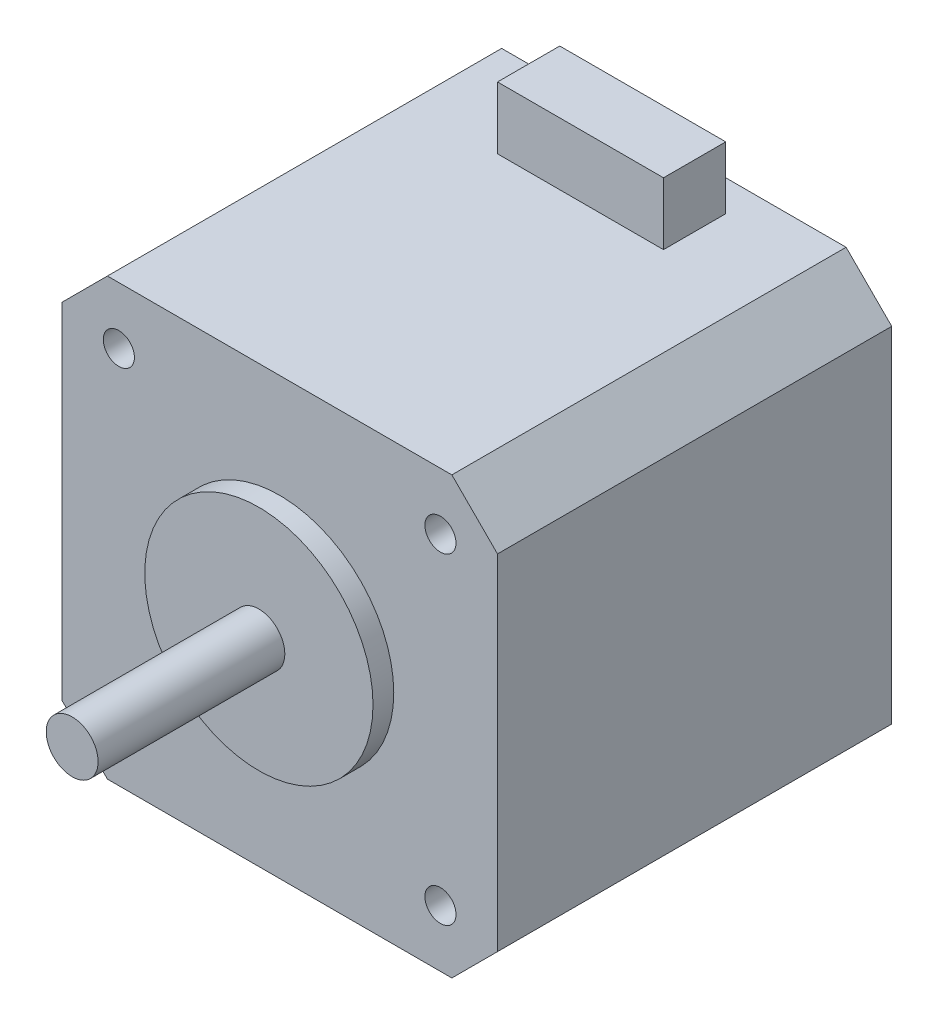
ISO-10303-21;
HEADER;
FILE_DESCRIPTION(('STEP AP214'),'2;1');
FILE_NAME('part.step','',(''),(''),'','','');
FILE_SCHEMA(('AUTOMOTIVE_DESIGN { 1 0 10303 214 1 1 1 1 }'));
ENDSEC;
DATA;
#1=APPLICATION_CONTEXT('core data for automotive mechanical design processes');
#2=APPLICATION_PROTOCOL_DEFINITION('international standard','automotive_design',2000,#1);
#3=PRODUCT_CONTEXT('',#1,'mechanical');
#4=PRODUCT('Part','Part','',(#3));
#5=PRODUCT_RELATED_PRODUCT_CATEGORY('part','',(#4));
#6=PRODUCT_DEFINITION_FORMATION('','',#4);
#7=PRODUCT_DEFINITION_CONTEXT('part definition',#1,'design');
#8=PRODUCT_DEFINITION('design','',#6,#7);
#9=PRODUCT_DEFINITION_SHAPE('','',#8);
#10=(LENGTH_UNIT() NAMED_UNIT(*) SI_UNIT(.MILLI.,.METRE.));
#11=(NAMED_UNIT(*) PLANE_ANGLE_UNIT() SI_UNIT($,.RADIAN.));
#12=(NAMED_UNIT(*) SI_UNIT($,.STERADIAN.) SOLID_ANGLE_UNIT());
#13=UNCERTAINTY_MEASURE_WITH_UNIT(LENGTH_MEASURE(1.E-05),#10,'distance_accuracy_value','');
#14=(GEOMETRIC_REPRESENTATION_CONTEXT(3) GLOBAL_UNCERTAINTY_ASSIGNED_CONTEXT((#13)) GLOBAL_UNIT_ASSIGNED_CONTEXT((#10,
#11,#12)) REPRESENTATION_CONTEXT('',''));
#15=CARTESIAN_POINT('',(0.,0.,0.));
#16=DIRECTION('',(0.,0.,1.));
#17=DIRECTION('',(1.,0.,0.));
#18=AXIS2_PLACEMENT_3D('',#15,#16,#17);
#19=CARTESIAN_POINT('',(0.,0.,38.));
#20=DIRECTION('',(0.,0.,1.));
#21=DIRECTION('',(1.,0.,0.));
#22=AXIS2_PLACEMENT_3D('',#19,#20,#21);
#23=PLANE('',#22);
#24=CARTESIAN_POINT('',(0.,0.,38.));
#25=DIRECTION('',(0.,0.,1.));
#26=DIRECTION('',(1.,0.,0.));
#27=AXIS2_PLACEMENT_3D('',#24,#25,#26);
#28=CIRCLE('',#27,11.);
#29=CARTESIAN_POINT('',(11.,0.,38.));
#30=VERTEX_POINT('',#29);
#31=EDGE_CURVE('E262',#30,#30,#28,.T.);
#32=ORIENTED_EDGE('',*,*,#31,.F.);
#33=EDGE_LOOP('',(#32));
#34=FACE_BOUND('',#33,.T.);
#35=CARTESIAN_POINT('',(-15.5000000000001,-15.4999999999999,38.));
#36=DIRECTION('',(0.,0.,1.));
#37=DIRECTION('',(1.,0.,0.));
#38=AXIS2_PLACEMENT_3D('',#35,#36,#37);
#39=CIRCLE('',#38,1.5);
#40=CARTESIAN_POINT('',(-14.0000000000001,-15.4999999999999,38.));
#41=VERTEX_POINT('',#40);
#42=EDGE_CURVE('E242',#41,#41,#39,.T.);
#43=ORIENTED_EDGE('',*,*,#42,.F.);
#44=EDGE_LOOP('',(#43));
#45=FACE_BOUND('',#44,.T.);
#46=CARTESIAN_POINT('',(15.5,15.5,38.));
#47=DIRECTION('',(0.,0.,1.));
#48=DIRECTION('',(1.,0.,0.));
#49=AXIS2_PLACEMENT_3D('',#46,#47,#48);
#50=CIRCLE('',#49,1.5);
#51=CARTESIAN_POINT('',(17.,15.5,38.));
#52=VERTEX_POINT('',#51);
#53=EDGE_CURVE('E161',#52,#52,#50,.T.);
#54=ORIENTED_EDGE('',*,*,#53,.F.);
#55=EDGE_LOOP('',(#54));
#56=FACE_BOUND('',#55,.T.);
#57=DIRECTION('',(0.,1.,0.));
#58=VECTOR('',#57,1.);
#59=CARTESIAN_POINT('',(20.9999999999999,-16.6000000000001,38.));
#60=LINE('',#59,#58);
#61=CARTESIAN_POINT('',(20.9999999999999,-16.6000000000001,38.));
#62=VERTEX_POINT('',#61);
#63=CARTESIAN_POINT('',(21.,16.6,38.));
#64=VERTEX_POINT('',#63);
#65=EDGE_CURVE('E108',#62,#64,#60,.T.);
#66=ORIENTED_EDGE('',*,*,#65,.T.);
#67=DIRECTION('',(-0.707106781186548,0.707106781186548,0.));
#68=VECTOR('',#67,1.);
#69=CARTESIAN_POINT('',(21.,16.6,38.));
#70=LINE('',#69,#68);
#71=CARTESIAN_POINT('',(16.6,21.,38.));
#72=VERTEX_POINT('',#71);
#73=EDGE_CURVE('E209',#64,#72,#70,.T.);
#74=ORIENTED_EDGE('',*,*,#73,.T.);
#75=DIRECTION('',(-1.,0.,0.));
#76=VECTOR('',#75,1.);
#77=CARTESIAN_POINT('',(16.6,21.,38.));
#78=LINE('',#77,#76);
#79=CARTESIAN_POINT('',(-16.5999999999998,21.0000000000002,38.));
#80=VERTEX_POINT('',#79);
#81=EDGE_CURVE('E205',#72,#80,#78,.T.);
#82=ORIENTED_EDGE('',*,*,#81,.T.);
#83=DIRECTION('',(-0.707106781186555,-0.70710678118654,0.));
#84=VECTOR('',#83,1.);
#85=CARTESIAN_POINT('',(-16.5999999999998,21.0000000000002,38.));
#86=LINE('',#85,#84);
#87=CARTESIAN_POINT('',(-20.9999999999998,16.6000000000002,38.));
#88=VERTEX_POINT('',#87);
#89=EDGE_CURVE('E220',#80,#88,#86,.T.);
#90=ORIENTED_EDGE('',*,*,#89,.T.);
#91=DIRECTION('',(0.,-1.,0.));
#92=VECTOR('',#91,1.);
#93=CARTESIAN_POINT('',(-20.9999999999998,16.6000000000002,38.));
#94=LINE('',#93,#92);
#95=CARTESIAN_POINT('',(-21.0000000000001,-16.5999999999999,38.));
#96=VERTEX_POINT('',#95);
#97=EDGE_CURVE('E132',#88,#96,#94,.T.);
#98=ORIENTED_EDGE('',*,*,#97,.T.);
#99=DIRECTION('',(0.707106781186542,-0.707106781186553,0.));
#100=VECTOR('',#99,1.);
#101=CARTESIAN_POINT('',(-21.0000000000001,-16.5999999999999,38.));
#102=LINE('',#101,#100);
#103=CARTESIAN_POINT('',(-16.6000000000002,-20.9999999999999,38.));
#104=VERTEX_POINT('',#103);
#105=EDGE_CURVE('E125',#96,#104,#102,.T.);
#106=ORIENTED_EDGE('',*,*,#105,.T.);
#107=DIRECTION('',(1.,0.,0.));
#108=VECTOR('',#107,1.);
#109=CARTESIAN_POINT('',(-16.6000000000002,-20.9999999999999,38.));
#110=LINE('',#109,#108);
#111=CARTESIAN_POINT('',(16.5999999999999,-21.0000000000001,38.));
#112=VERTEX_POINT('',#111);
#113=EDGE_CURVE('E129',#104,#112,#110,.T.);
#114=ORIENTED_EDGE('',*,*,#113,.T.);
#115=DIRECTION('',(0.70710678118655,0.707106781186545,0.));
#116=VECTOR('',#115,1.);
#117=CARTESIAN_POINT('',(16.5999999999999,-21.0000000000001,38.));
#118=LINE('',#117,#116);
#119=EDGE_CURVE('E69',#112,#62,#118,.T.);
#120=ORIENTED_EDGE('',*,*,#119,.T.);
#121=EDGE_LOOP('',(#66,#74,#82,#90,#98,#106,#114,#120));
#122=FACE_BOUND('',#121,.T.);
#123=CARTESIAN_POINT('',(15.4999999999999,-15.5000000000001,38.));
#124=DIRECTION('',(0.,0.,1.));
#125=DIRECTION('',(1.,0.,0.));
#126=AXIS2_PLACEMENT_3D('',#123,#124,#125);
#127=CIRCLE('',#126,1.5);
#128=CARTESIAN_POINT('',(16.9999999999999,-15.5000000000001,38.));
#129=VERTEX_POINT('',#128);
#130=EDGE_CURVE('E234',#129,#129,#127,.T.);
#131=ORIENTED_EDGE('',*,*,#130,.F.);
#132=EDGE_LOOP('',(#131));
#133=FACE_BOUND('',#132,.T.);
#134=CARTESIAN_POINT('',(-15.4999999999998,15.5000000000002,38.));
#135=DIRECTION('',(0.,0.,1.));
#136=DIRECTION('',(1.,0.,0.));
#137=AXIS2_PLACEMENT_3D('',#134,#135,#136);
#138=CIRCLE('',#137,1.5);
#139=CARTESIAN_POINT('',(-13.9999999999998,15.5000000000002,38.));
#140=VERTEX_POINT('',#139);
#141=EDGE_CURVE('E250',#140,#140,#138,.T.);
#142=ORIENTED_EDGE('',*,*,#141,.F.);
#143=EDGE_LOOP('',(#142));
#144=FACE_BOUND('',#143,.T.);
#145=ADVANCED_FACE('F43',(#34,#45,#56,#122,#133,#144),#23,.T.);
#146=CARTESIAN_POINT('',(0.,0.,0.));
#147=DIRECTION('',(0.,0.,1.));
#148=DIRECTION('',(1.,0.,0.));
#149=AXIS2_PLACEMENT_3D('',#146,#147,#148);
#150=PLANE('',#149);
#151=DIRECTION('',(0.,1.,0.));
#152=VECTOR('',#151,1.);
#153=CARTESIAN_POINT('',(21.,0.,0.));
#154=LINE('',#153,#152);
#155=CARTESIAN_POINT('',(20.9999999999999,-16.6000000000001,0.));
#156=VERTEX_POINT('',#155);
#157=CARTESIAN_POINT('',(21.,16.6,0.));
#158=VERTEX_POINT('',#157);
#159=EDGE_CURVE('E102',#156,#158,#154,.T.);
#160=ORIENTED_EDGE('',*,*,#159,.F.);
#161=DIRECTION('',(0.70710678118655,0.707106781186545,0.));
#162=VECTOR('',#161,1.);
#163=CARTESIAN_POINT('',(16.5999999999999,-21.0000000000001,0.));
#164=LINE('',#163,#162);
#165=CARTESIAN_POINT('',(16.5999999999999,-21.0000000000001,0.));
#166=VERTEX_POINT('',#165);
#167=EDGE_CURVE('E180',#166,#156,#164,.T.);
#168=ORIENTED_EDGE('',*,*,#167,.F.);
#169=DIRECTION('',(1.,0.,0.));
#170=VECTOR('',#169,1.);
#171=CARTESIAN_POINT('',(0.,-21.,0.));
#172=LINE('',#171,#170);
#173=CARTESIAN_POINT('',(-16.6000000000002,-20.9999999999999,0.));
#174=VERTEX_POINT('',#173);
#175=EDGE_CURVE('E177',#174,#166,#172,.T.);
#176=ORIENTED_EDGE('',*,*,#175,.F.);
#177=DIRECTION('',(0.707106781186542,-0.707106781186553,0.));
#178=VECTOR('',#177,1.);
#179=CARTESIAN_POINT('',(-21.0000000000001,-16.5999999999999,0.));
#180=LINE('',#179,#178);
#181=CARTESIAN_POINT('',(-21.0000000000001,-16.5999999999999,0.));
#182=VERTEX_POINT('',#181);
#183=EDGE_CURVE('E143',#182,#174,#180,.T.);
#184=ORIENTED_EDGE('',*,*,#183,.F.);
#185=DIRECTION('',(0.,-1.,0.));
#186=VECTOR('',#185,1.);
#187=CARTESIAN_POINT('',(-21.,1.46642216231412E-13,0.));
#188=LINE('',#187,#186);
#189=CARTESIAN_POINT('',(-20.9999999999998,16.6000000000002,0.));
#190=VERTEX_POINT('',#189);
#191=EDGE_CURVE('E172',#190,#182,#188,.T.);
#192=ORIENTED_EDGE('',*,*,#191,.F.);
#193=DIRECTION('',(-0.707106781186555,-0.70710678118654,0.));
#194=VECTOR('',#193,1.);
#195=CARTESIAN_POINT('',(-16.5999999999998,21.0000000000002,0.));
#196=LINE('',#195,#194);
#197=CARTESIAN_POINT('',(-16.5999999999998,21.0000000000002,0.));
#198=VERTEX_POINT('',#197);
#199=EDGE_CURVE('E168',#198,#190,#196,.T.);
#200=ORIENTED_EDGE('',*,*,#199,.F.);
#201=DIRECTION('',(-1.,0.,0.));
#202=VECTOR('',#201,1.);
#203=CARTESIAN_POINT('',(0.,21.,0.));
#204=LINE('',#203,#202);
#205=CARTESIAN_POINT('',(16.6,21.,0.));
#206=VERTEX_POINT('',#205);
#207=EDGE_CURVE('E165',#206,#198,#204,.T.);
#208=ORIENTED_EDGE('',*,*,#207,.F.);
#209=DIRECTION('',(-0.707106781186548,0.707106781186548,0.));
#210=VECTOR('',#209,1.);
#211=CARTESIAN_POINT('',(21.,16.6,0.));
#212=LINE('',#211,#210);
#213=EDGE_CURVE('E160',#158,#206,#212,.T.);
#214=ORIENTED_EDGE('',*,*,#213,.F.);
#215=EDGE_LOOP('',(#160,#168,#176,#184,#192,#200,#208,#214));
#216=FACE_BOUND('',#215,.T.);
#217=CARTESIAN_POINT('',(15.5,15.5,0.));
#218=DIRECTION('',(0.,0.,1.));
#219=DIRECTION('',(1.,0.,0.));
#220=AXIS2_PLACEMENT_3D('',#217,#218,#219);
#221=CIRCLE('',#220,1.5);
#222=CARTESIAN_POINT('',(17.,15.5,0.));
#223=VERTEX_POINT('',#222);
#224=EDGE_CURVE('E230',#223,#223,#221,.T.);
#225=ORIENTED_EDGE('',*,*,#224,.T.);
#226=EDGE_LOOP('',(#225));
#227=FACE_BOUND('',#226,.T.);
#228=CARTESIAN_POINT('',(15.4999999999999,-15.5000000000001,0.));
#229=DIRECTION('',(0.,0.,1.));
#230=DIRECTION('',(1.,0.,0.));
#231=AXIS2_PLACEMENT_3D('',#228,#229,#230);
#232=CIRCLE('',#231,1.5);
#233=CARTESIAN_POINT('',(16.9999999999999,-15.5000000000001,0.));
#234=VERTEX_POINT('',#233);
#235=EDGE_CURVE('E238',#234,#234,#232,.T.);
#236=ORIENTED_EDGE('',*,*,#235,.T.);
#237=EDGE_LOOP('',(#236));
#238=FACE_BOUND('',#237,.T.);
#239=CARTESIAN_POINT('',(-15.5000000000001,-15.4999999999999,0.));
#240=DIRECTION('',(0.,0.,1.));
#241=DIRECTION('',(1.,0.,0.));
#242=AXIS2_PLACEMENT_3D('',#239,#240,#241);
#243=CIRCLE('',#242,1.5);
#244=CARTESIAN_POINT('',(-14.0000000000001,-15.4999999999999,0.));
#245=VERTEX_POINT('',#244);
#246=EDGE_CURVE('E246',#245,#245,#243,.T.);
#247=ORIENTED_EDGE('',*,*,#246,.T.);
#248=EDGE_LOOP('',(#247));
#249=FACE_BOUND('',#248,.T.);
#250=CARTESIAN_POINT('',(-15.4999999999998,15.5000000000002,0.));
#251=DIRECTION('',(0.,0.,1.));
#252=DIRECTION('',(1.,0.,0.));
#253=AXIS2_PLACEMENT_3D('',#250,#251,#252);
#254=CIRCLE('',#253,1.5);
#255=CARTESIAN_POINT('',(-13.9999999999998,15.5000000000002,0.));
#256=VERTEX_POINT('',#255);
#257=EDGE_CURVE('E254',#256,#256,#254,.T.);
#258=ORIENTED_EDGE('',*,*,#257,.T.);
#259=EDGE_LOOP('',(#258));
#260=FACE_BOUND('',#259,.T.);
#261=ADVANCED_FACE('F210',(#216,#227,#238,#249,#260),#150,.F.);
#262=CARTESIAN_POINT('',(21.,0.,38.));
#263=DIRECTION('',(-1.,0.,0.));
#264=DIRECTION('',(0.,0.,1.));
#265=AXIS2_PLACEMENT_3D('',#262,#263,#264);
#266=PLANE('',#265);
#267=ORIENTED_EDGE('',*,*,#159,.T.);
#268=DIRECTION('',(0.,0.,-1.));
#269=VECTOR('',#268,1.);
#270=CARTESIAN_POINT('',(21.,16.6,38.));
#271=LINE('',#270,#269);
#272=EDGE_CURVE('E11',#64,#158,#271,.T.);
#273=ORIENTED_EDGE('',*,*,#272,.F.);
#274=ORIENTED_EDGE('',*,*,#65,.F.);
#275=DIRECTION('',(0.,0.,-1.));
#276=VECTOR('',#275,1.);
#277=CARTESIAN_POINT('',(20.9999999999999,-16.6000000000001,38.));
#278=LINE('',#277,#276);
#279=EDGE_CURVE('E154',#62,#156,#278,.T.);
#280=ORIENTED_EDGE('',*,*,#279,.T.);
#281=EDGE_LOOP('',(#267,#273,#274,#280));
#282=FACE_BOUND('',#281,.T.);
#283=ADVANCED_FACE('F45',(#282),#266,.F.);
#284=CARTESIAN_POINT('',(21.,16.6,38.));
#285=DIRECTION('',(-0.707106781186548,-0.707106781186548,0.));
#286=DIRECTION('',(0.707106781186548,-0.707106781186548,0.));
#287=AXIS2_PLACEMENT_3D('',#284,#285,#286);
#288=PLANE('',#287);
#289=ORIENTED_EDGE('',*,*,#213,.T.);
#290=DIRECTION('',(0.,0.,-1.));
#291=VECTOR('',#290,1.);
#292=CARTESIAN_POINT('',(16.6,21.,38.));
#293=LINE('',#292,#291);
#294=EDGE_CURVE('E53',#72,#206,#293,.T.);
#295=ORIENTED_EDGE('',*,*,#294,.F.);
#296=ORIENTED_EDGE('',*,*,#73,.F.);
#297=ORIENTED_EDGE('',*,*,#272,.T.);
#298=EDGE_LOOP('',(#289,#295,#296,#297));
#299=FACE_BOUND('',#298,.T.);
#300=ADVANCED_FACE('F208',(#299),#288,.F.);
#301=CARTESIAN_POINT('',(0.,21.,38.));
#302=DIRECTION('',(0.,-1.,0.));
#303=DIRECTION('',(1.,0.,0.));
#304=AXIS2_PLACEMENT_3D('',#301,#302,#303);
#305=PLANE('',#304);
#306=DIRECTION('',(0.,0.,-1.));
#307=VECTOR('',#306,1.);
#308=CARTESIAN_POINT('',(-7.99999999999978,21.0000000000001,9.));
#309=LINE('',#308,#307);
#310=CARTESIAN_POINT('',(-7.99999999999978,21.0000000000001,9.));
#311=VERTEX_POINT('',#310);
#312=CARTESIAN_POINT('',(-7.99999999999978,21.0000000000001,3.));
#313=VERTEX_POINT('',#312);
#314=EDGE_CURVE('E288',#311,#313,#309,.T.);
#315=ORIENTED_EDGE('',*,*,#314,.T.);
#316=DIRECTION('',(1.,0.,0.));
#317=VECTOR('',#316,1.);
#318=CARTESIAN_POINT('',(-7.99999999999978,21.0000000000001,3.));
#319=LINE('',#318,#317);
#320=CARTESIAN_POINT('',(8.00000000000022,20.9999999999999,3.));
#321=VERTEX_POINT('',#320);
#322=EDGE_CURVE('E299',#313,#321,#319,.T.);
#323=ORIENTED_EDGE('',*,*,#322,.T.);
#324=DIRECTION('',(0.,0.,1.));
#325=VECTOR('',#324,1.);
#326=CARTESIAN_POINT('',(8.00000000000022,20.9999999999999,3.));
#327=LINE('',#326,#325);
#328=CARTESIAN_POINT('',(8.00000000000022,20.9999999999999,9.));
#329=VERTEX_POINT('',#328);
#330=EDGE_CURVE('E295',#321,#329,#327,.T.);
#331=ORIENTED_EDGE('',*,*,#330,.T.);
#332=DIRECTION('',(1.,0.,0.));
#333=VECTOR('',#332,1.);
#334=CARTESIAN_POINT('',(-7.99999999999978,21.0000000000001,9.));
#335=LINE('',#334,#333);
#336=EDGE_CURVE('E60',#311,#329,#335,.T.);
#337=ORIENTED_EDGE('',*,*,#336,.F.);
#338=EDGE_LOOP('',(#315,#323,#331,#337));
#339=FACE_BOUND('',#338,.T.);
#340=ORIENTED_EDGE('',*,*,#207,.T.);
#341=DIRECTION('',(0.,0.,-1.));
#342=VECTOR('',#341,1.);
#343=CARTESIAN_POINT('',(-16.5999999999998,21.0000000000002,38.));
#344=LINE('',#343,#342);
#345=EDGE_CURVE('E194',#80,#198,#344,.T.);
#346=ORIENTED_EDGE('',*,*,#345,.F.);
#347=ORIENTED_EDGE('',*,*,#81,.F.);
#348=ORIENTED_EDGE('',*,*,#294,.T.);
#349=EDGE_LOOP('',(#340,#346,#347,#348));
#350=FACE_BOUND('',#349,.T.);
#351=ADVANCED_FACE('F203',(#339,#350),#305,.F.);
#352=CARTESIAN_POINT('',(-16.5999999999998,21.0000000000002,38.));
#353=DIRECTION('',(0.70710678118654,-0.707106781186555,0.));
#354=DIRECTION('',(0.707106781186555,0.70710678118654,0.));
#355=AXIS2_PLACEMENT_3D('',#352,#353,#354);
#356=PLANE('',#355);
#357=ORIENTED_EDGE('',*,*,#199,.T.);
#358=DIRECTION('',(0.,0.,-1.));
#359=VECTOR('',#358,1.);
#360=CARTESIAN_POINT('',(-20.9999999999998,16.6000000000002,38.));
#361=LINE('',#360,#359);
#362=EDGE_CURVE('E190',#88,#190,#361,.T.);
#363=ORIENTED_EDGE('',*,*,#362,.F.);
#364=ORIENTED_EDGE('',*,*,#89,.F.);
#365=ORIENTED_EDGE('',*,*,#345,.T.);
#366=EDGE_LOOP('',(#357,#363,#364,#365));
#367=FACE_BOUND('',#366,.T.);
#368=ADVANCED_FACE('F215',(#367),#356,.F.);
#369=CARTESIAN_POINT('',(-21.,1.46642216231412E-13,38.));
#370=DIRECTION('',(1.,0.,0.));
#371=DIRECTION('',(0.,1.,0.));
#372=AXIS2_PLACEMENT_3D('',#369,#370,#371);
#373=PLANE('',#372);
#374=ORIENTED_EDGE('',*,*,#191,.T.);
#375=DIRECTION('',(0.,0.,-1.));
#376=VECTOR('',#375,1.);
#377=CARTESIAN_POINT('',(-21.0000000000001,-16.5999999999999,38.));
#378=LINE('',#377,#376);
#379=EDGE_CURVE('E146',#96,#182,#378,.T.);
#380=ORIENTED_EDGE('',*,*,#379,.F.);
#381=ORIENTED_EDGE('',*,*,#97,.F.);
#382=ORIENTED_EDGE('',*,*,#362,.T.);
#383=EDGE_LOOP('',(#374,#380,#381,#382));
#384=FACE_BOUND('',#383,.T.);
#385=ADVANCED_FACE('F218',(#384),#373,.F.);
#386=CARTESIAN_POINT('',(-21.0000000000001,-16.5999999999999,38.));
#387=DIRECTION('',(0.707106781186553,0.707106781186542,0.));
#388=DIRECTION('',(-0.707106781186542,0.707106781186553,0.));
#389=AXIS2_PLACEMENT_3D('',#386,#387,#388);
#390=PLANE('',#389);
#391=ORIENTED_EDGE('',*,*,#183,.T.);
#392=DIRECTION('',(0.,0.,-1.));
#393=VECTOR('',#392,1.);
#394=CARTESIAN_POINT('',(-16.6000000000002,-20.9999999999999,38.));
#395=LINE('',#394,#393);
#396=EDGE_CURVE('E140',#104,#174,#395,.T.);
#397=ORIENTED_EDGE('',*,*,#396,.F.);
#398=ORIENTED_EDGE('',*,*,#105,.F.);
#399=ORIENTED_EDGE('',*,*,#379,.T.);
#400=EDGE_LOOP('',(#391,#397,#398,#399));
#401=FACE_BOUND('',#400,.T.);
#402=ADVANCED_FACE('F141',(#401),#390,.F.);
#403=CARTESIAN_POINT('',(0.,-21.,38.));
#404=DIRECTION('',(0.,1.,0.));
#405=DIRECTION('',(-1.,0.,0.));
#406=AXIS2_PLACEMENT_3D('',#403,#404,#405);
#407=PLANE('',#406);
#408=ORIENTED_EDGE('',*,*,#175,.T.);
#409=DIRECTION('',(0.,0.,-1.));
#410=VECTOR('',#409,1.);
#411=CARTESIAN_POINT('',(16.5999999999999,-21.0000000000001,38.));
#412=LINE('',#411,#410);
#413=EDGE_CURVE('E147',#112,#166,#412,.T.);
#414=ORIENTED_EDGE('',*,*,#413,.F.);
#415=ORIENTED_EDGE('',*,*,#113,.F.);
#416=ORIENTED_EDGE('',*,*,#396,.T.);
#417=EDGE_LOOP('',(#408,#414,#415,#416));
#418=FACE_BOUND('',#417,.T.);
#419=ADVANCED_FACE('F149',(#418),#407,.F.);
#420=CARTESIAN_POINT('',(16.5999999999999,-21.0000000000001,38.));
#421=DIRECTION('',(-0.707106781186545,0.70710678118655,0.));
#422=DIRECTION('',(-0.70710678118655,-0.707106781186545,0.));
#423=AXIS2_PLACEMENT_3D('',#420,#421,#422);
#424=PLANE('',#423);
#425=ORIENTED_EDGE('',*,*,#167,.T.);
#426=ORIENTED_EDGE('',*,*,#279,.F.);
#427=ORIENTED_EDGE('',*,*,#119,.F.);
#428=ORIENTED_EDGE('',*,*,#413,.T.);
#429=EDGE_LOOP('',(#425,#426,#427,#428));
#430=FACE_BOUND('',#429,.T.);
#431=ADVANCED_FACE('F366',(#430),#424,.F.);
#432=CARTESIAN_POINT('',(15.5,15.5,38.));
#433=DIRECTION('',(0.,0.,-1.));
#434=DIRECTION('',(-1.,0.,0.));
#435=AXIS2_PLACEMENT_3D('',#432,#433,#434);
#436=CYLINDRICAL_SURFACE('',#435,1.5);
#437=ORIENTED_EDGE('',*,*,#53,.T.);
#438=EDGE_LOOP('',(#437));
#439=FACE_BOUND('',#438,.T.);
#440=ORIENTED_EDGE('',*,*,#224,.F.);
#441=EDGE_LOOP('',(#440));
#442=FACE_BOUND('',#441,.T.);
#443=ADVANCED_FACE('F363',(#439,#442),#436,.F.);
#444=CARTESIAN_POINT('',(15.4999999999999,-15.5000000000001,38.));
#445=DIRECTION('',(0.,0.,-1.));
#446=DIRECTION('',(-1.,0.,0.));
#447=AXIS2_PLACEMENT_3D('',#444,#445,#446);
#448=CYLINDRICAL_SURFACE('',#447,1.5);
#449=ORIENTED_EDGE('',*,*,#130,.T.);
#450=EDGE_LOOP('',(#449));
#451=FACE_BOUND('',#450,.T.);
#452=ORIENTED_EDGE('',*,*,#235,.F.);
#453=EDGE_LOOP('',(#452));
#454=FACE_BOUND('',#453,.T.);
#455=ADVANCED_FACE('F397',(#451,#454),#448,.F.);
#456=CARTESIAN_POINT('',(-15.5000000000001,-15.4999999999999,38.));
#457=DIRECTION('',(0.,0.,-1.));
#458=DIRECTION('',(-1.,0.,0.));
#459=AXIS2_PLACEMENT_3D('',#456,#457,#458);
#460=CYLINDRICAL_SURFACE('',#459,1.5);
#461=ORIENTED_EDGE('',*,*,#42,.T.);
#462=EDGE_LOOP('',(#461));
#463=FACE_BOUND('',#462,.T.);
#464=ORIENTED_EDGE('',*,*,#246,.F.);
#465=EDGE_LOOP('',(#464));
#466=FACE_BOUND('',#465,.T.);
#467=ADVANCED_FACE('F404',(#463,#466),#460,.F.);
#468=CARTESIAN_POINT('',(-15.4999999999998,15.5000000000002,38.));
#469=DIRECTION('',(0.,0.,-1.));
#470=DIRECTION('',(-1.,0.,0.));
#471=AXIS2_PLACEMENT_3D('',#468,#469,#470);
#472=CYLINDRICAL_SURFACE('',#471,1.5);
#473=ORIENTED_EDGE('',*,*,#141,.T.);
#474=EDGE_LOOP('',(#473));
#475=FACE_BOUND('',#474,.T.);
#476=ORIENTED_EDGE('',*,*,#257,.F.);
#477=EDGE_LOOP('',(#476));
#478=FACE_BOUND('',#477,.T.);
#479=ADVANCED_FACE('F411',(#475,#478),#472,.F.);
#480=CARTESIAN_POINT('',(0.,0.,40.));
#481=DIRECTION('',(0.,0.,-1.));
#482=DIRECTION('',(-1.,0.,0.));
#483=AXIS2_PLACEMENT_3D('',#480,#481,#482);
#484=CYLINDRICAL_SURFACE('',#483,11.);
#485=CARTESIAN_POINT('',(0.,0.,40.));
#486=DIRECTION('',(0.,0.,1.));
#487=DIRECTION('',(1.,0.,0.));
#488=AXIS2_PLACEMENT_3D('',#485,#486,#487);
#489=CIRCLE('',#488,11.);
#490=CARTESIAN_POINT('',(11.,0.,40.));
#491=VERTEX_POINT('',#490);
#492=EDGE_CURVE('E258',#491,#491,#489,.T.);
#493=ORIENTED_EDGE('',*,*,#492,.F.);
#494=EDGE_LOOP('',(#493));
#495=FACE_BOUND('',#494,.T.);
#496=ORIENTED_EDGE('',*,*,#31,.T.);
#497=EDGE_LOOP('',(#496));
#498=FACE_BOUND('',#497,.T.);
#499=ADVANCED_FACE('F419',(#495,#498),#484,.T.);
#500=CARTESIAN_POINT('',(0.,0.,40.));
#501=DIRECTION('',(0.,0.,1.));
#502=DIRECTION('',(1.,0.,0.));
#503=AXIS2_PLACEMENT_3D('',#500,#501,#502);
#504=PLANE('',#503);
#505=CARTESIAN_POINT('',(0.,0.,40.));
#506=DIRECTION('',(0.,0.,1.));
#507=DIRECTION('',(1.,0.,0.));
#508=AXIS2_PLACEMENT_3D('',#505,#506,#507);
#509=CIRCLE('',#508,2.5);
#510=CARTESIAN_POINT('',(2.5,0.,40.));
#511=VERTEX_POINT('',#510);
#512=EDGE_CURVE('E47',#511,#511,#509,.F.);
#513=ORIENTED_EDGE('',*,*,#512,.T.);
#514=EDGE_LOOP('',(#513));
#515=FACE_BOUND('',#514,.T.);
#516=ORIENTED_EDGE('',*,*,#492,.T.);
#517=EDGE_LOOP('',(#516));
#518=FACE_BOUND('',#517,.T.);
#519=ADVANCED_FACE('F427',(#515,#518),#504,.T.);
#520=CARTESIAN_POINT('',(0.,0.,58.));
#521=DIRECTION('',(0.,0.,-1.));
#522=DIRECTION('',(-1.,0.,0.));
#523=AXIS2_PLACEMENT_3D('',#520,#521,#522);
#524=CYLINDRICAL_SURFACE('',#523,2.5);
#525=ORIENTED_EDGE('',*,*,#512,.F.);
#526=EDGE_LOOP('',(#525));
#527=FACE_BOUND('',#526,.T.);
#528=CARTESIAN_POINT('',(0.,0.,58.));
#529=DIRECTION('',(0.,0.,1.));
#530=DIRECTION('',(1.,0.,0.));
#531=AXIS2_PLACEMENT_3D('',#528,#529,#530);
#532=CIRCLE('',#531,2.5);
#533=CARTESIAN_POINT('',(2.5,0.,58.));
#534=VERTEX_POINT('',#533);
#535=EDGE_CURVE('E269',#534,#534,#532,.T.);
#536=ORIENTED_EDGE('',*,*,#535,.F.);
#537=EDGE_LOOP('',(#536));
#538=FACE_BOUND('',#537,.T.);
#539=ADVANCED_FACE('F435',(#527,#538),#524,.T.);
#540=CARTESIAN_POINT('',(0.,0.,58.));
#541=DIRECTION('',(0.,0.,1.));
#542=DIRECTION('',(1.,0.,0.));
#543=AXIS2_PLACEMENT_3D('',#540,#541,#542);
#544=PLANE('',#543);
#545=ORIENTED_EDGE('',*,*,#535,.T.);
#546=EDGE_LOOP('',(#545));
#547=FACE_BOUND('',#546,.T.);
#548=ADVANCED_FACE('F443',(#547),#544,.T.);
#549=CARTESIAN_POINT('',(-7.99999999999972,27.0000000000001,3.));
#550=DIRECTION('',(0.,0.,-1.));
#551=DIRECTION('',(-1.,0.,0.));
#552=AXIS2_PLACEMENT_3D('',#549,#550,#551);
#553=PLANE('',#552);
#554=ORIENTED_EDGE('',*,*,#322,.F.);
#555=DIRECTION('',(0.,-1.,0.));
#556=VECTOR('',#555,1.);
#557=CARTESIAN_POINT('',(-7.99999999999972,27.0000000000001,3.));
#558=LINE('',#557,#556);
#559=CARTESIAN_POINT('',(-7.99999999999972,27.0000000000001,3.));
#560=VERTEX_POINT('',#559);
#561=EDGE_CURVE('E273',#560,#313,#558,.T.);
#562=ORIENTED_EDGE('',*,*,#561,.F.);
#563=DIRECTION('',(1.,0.,0.));
#564=VECTOR('',#563,1.);
#565=CARTESIAN_POINT('',(-7.99999999999972,27.0000000000001,3.));
#566=LINE('',#565,#564);
#567=CARTESIAN_POINT('',(8.00000000000028,26.9999999999999,3.));
#568=VERTEX_POINT('',#567);
#569=EDGE_CURVE('E292',#560,#568,#566,.T.);
#570=ORIENTED_EDGE('',*,*,#569,.T.);
#571=DIRECTION('',(0.,-1.,0.));
#572=VECTOR('',#571,1.);
#573=CARTESIAN_POINT('',(8.00000000000028,26.9999999999999,3.));
#574=LINE('',#573,#572);
#575=EDGE_CURVE('E274',#568,#321,#574,.T.);
#576=ORIENTED_EDGE('',*,*,#575,.T.);
#577=EDGE_LOOP('',(#554,#562,#570,#576));
#578=FACE_BOUND('',#577,.T.);
#579=ADVANCED_FACE('F321',(#578),#553,.T.);
#580=CARTESIAN_POINT('',(-7.99999999999972,27.0000000000001,9.));
#581=DIRECTION('',(-1.,0.,0.));
#582=DIRECTION('',(0.,-1.,0.));
#583=AXIS2_PLACEMENT_3D('',#580,#581,#582);
#584=PLANE('',#583);
#585=ORIENTED_EDGE('',*,*,#314,.F.);
#586=DIRECTION('',(0.,-1.,0.));
#587=VECTOR('',#586,1.);
#588=CARTESIAN_POINT('',(-7.99999999999972,27.0000000000001,9.));
#589=LINE('',#588,#587);
#590=CARTESIAN_POINT('',(-7.99999999999972,27.0000000000001,9.));
#591=VERTEX_POINT('',#590);
#592=EDGE_CURVE('E282',#591,#311,#589,.T.);
#593=ORIENTED_EDGE('',*,*,#592,.F.);
#594=DIRECTION('',(0.,0.,-1.));
#595=VECTOR('',#594,1.);
#596=CARTESIAN_POINT('',(-7.99999999999972,27.0000000000001,9.));
#597=LINE('',#596,#595);
#598=EDGE_CURVE('E279',#591,#560,#597,.T.);
#599=ORIENTED_EDGE('',*,*,#598,.T.);
#600=ORIENTED_EDGE('',*,*,#561,.T.);
#601=EDGE_LOOP('',(#585,#593,#599,#600));
#602=FACE_BOUND('',#601,.T.);
#603=ADVANCED_FACE('F336',(#602),#584,.T.);
#604=CARTESIAN_POINT('',(-7.99999999999972,27.0000000000001,9.));
#605=DIRECTION('',(0.,0.,-1.));
#606=DIRECTION('',(-1.,0.,0.));
#607=AXIS2_PLACEMENT_3D('',#604,#605,#606);
#608=PLANE('',#607);
#609=ORIENTED_EDGE('',*,*,#336,.T.);
#610=DIRECTION('',(0.,-1.,0.));
#611=VECTOR('',#610,1.);
#612=CARTESIAN_POINT('',(8.00000000000028,26.9999999999999,9.));
#613=LINE('',#612,#611);
#614=CARTESIAN_POINT('',(8.00000000000028,26.9999999999999,9.));
#615=VERTEX_POINT('',#614);
#616=EDGE_CURVE('E278',#615,#329,#613,.T.);
#617=ORIENTED_EDGE('',*,*,#616,.F.);
#618=DIRECTION('',(1.,0.,0.));
#619=VECTOR('',#618,1.);
#620=CARTESIAN_POINT('',(-7.99999999999972,27.0000000000001,9.));
#621=LINE('',#620,#619);
#622=EDGE_CURVE('E306',#591,#615,#621,.T.);
#623=ORIENTED_EDGE('',*,*,#622,.F.);
#624=ORIENTED_EDGE('',*,*,#592,.T.);
#625=EDGE_LOOP('',(#609,#617,#623,#624));
#626=FACE_BOUND('',#625,.T.);
#627=ADVANCED_FACE('F340',(#626),#608,.F.);
#628=CARTESIAN_POINT('',(8.00000000000028,26.9999999999999,3.));
#629=DIRECTION('',(1.,0.,0.));
#630=DIRECTION('',(0.,1.,0.));
#631=AXIS2_PLACEMENT_3D('',#628,#629,#630);
#632=PLANE('',#631);
#633=ORIENTED_EDGE('',*,*,#330,.F.);
#634=ORIENTED_EDGE('',*,*,#575,.F.);
#635=DIRECTION('',(0.,0.,1.));
#636=VECTOR('',#635,1.);
#637=CARTESIAN_POINT('',(8.00000000000028,26.9999999999999,3.));
#638=LINE('',#637,#636);
#639=EDGE_CURVE('E310',#568,#615,#638,.T.);
#640=ORIENTED_EDGE('',*,*,#639,.T.);
#641=ORIENTED_EDGE('',*,*,#616,.T.);
#642=EDGE_LOOP('',(#633,#634,#640,#641));
#643=FACE_BOUND('',#642,.T.);
#644=ADVANCED_FACE('F344',(#643),#632,.T.);
#645=CARTESIAN_POINT('',(2.81276006502361E-13,27.,0.));
#646=DIRECTION('',(0.,-1.,0.));
#647=DIRECTION('',(1.,0.,0.));
#648=AXIS2_PLACEMENT_3D('',#645,#646,#647);
#649=PLANE('',#648);
#650=ORIENTED_EDGE('',*,*,#569,.F.);
#651=ORIENTED_EDGE('',*,*,#598,.F.);
#652=ORIENTED_EDGE('',*,*,#622,.T.);
#653=ORIENTED_EDGE('',*,*,#639,.F.);
#654=EDGE_LOOP('',(#650,#651,#652,#653));
#655=FACE_BOUND('',#654,.T.);
#656=ADVANCED_FACE('F330',(#655),#649,.F.);
#657=CLOSED_SHELL('',(#145,#261,#283,#300,#351,#368,#385,#402,#419,#431,#443,#455,#467,#479,
#499,#519,#539,#548,#579,#603,#627,#644,#656));
#658=MANIFOLD_SOLID_BREP('B2',#657);
#659=ADVANCED_BREP_SHAPE_REPRESENTATION('',(#18,#658),#14);
#660=SHAPE_DEFINITION_REPRESENTATION(#9,#659);
ENDSEC;
END-ISO-10303-21;
